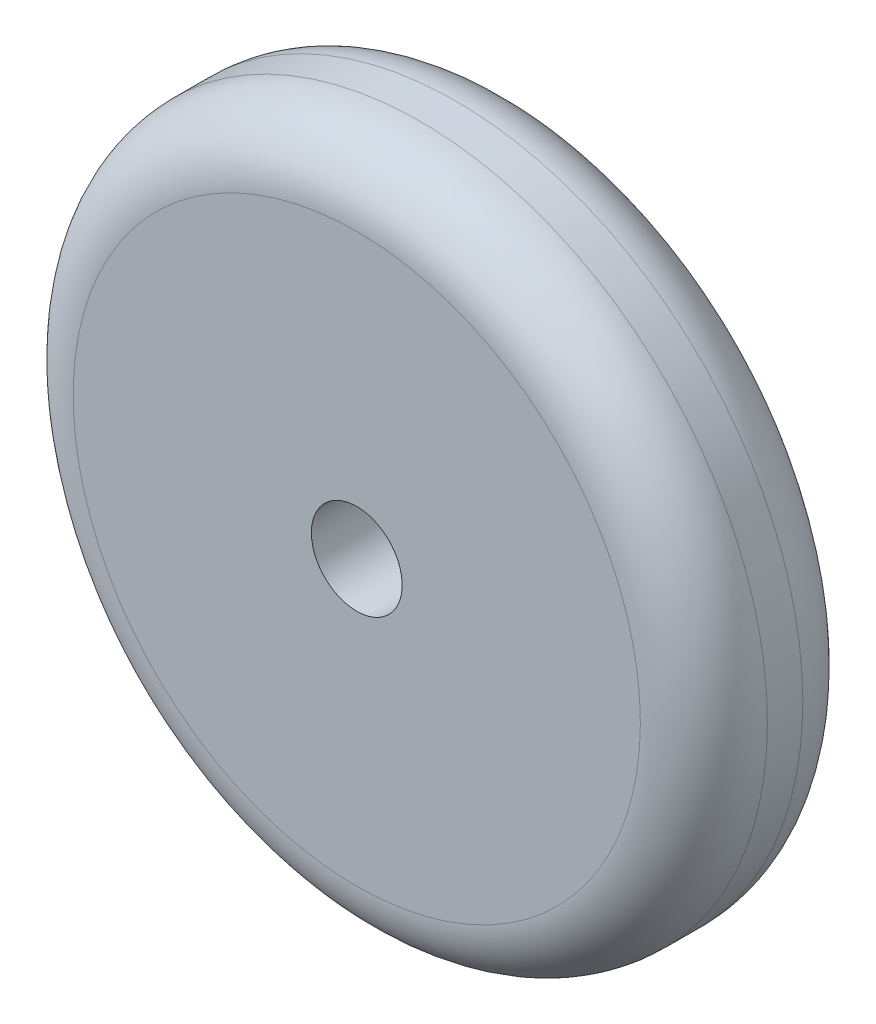
ISO-10303-21;
HEADER;
FILE_DESCRIPTION(('STEP AP214'),'2;1');
FILE_NAME('part.step','',(''),(''),'','','');
FILE_SCHEMA(('AUTOMOTIVE_DESIGN { 1 0 10303 214 1 1 1 1 }'));
ENDSEC;
DATA;
#1=APPLICATION_CONTEXT('core data for automotive mechanical design processes');
#2=APPLICATION_PROTOCOL_DEFINITION('international standard','automotive_design',2000,#1);
#3=PRODUCT_CONTEXT('',#1,'mechanical');
#4=PRODUCT('Part','Part','',(#3));
#5=PRODUCT_RELATED_PRODUCT_CATEGORY('part','',(#4));
#6=PRODUCT_DEFINITION_FORMATION('','',#4);
#7=PRODUCT_DEFINITION_CONTEXT('part definition',#1,'design');
#8=PRODUCT_DEFINITION('design','',#6,#7);
#9=PRODUCT_DEFINITION_SHAPE('','',#8);
#10=(LENGTH_UNIT() NAMED_UNIT(*) SI_UNIT(.MILLI.,.METRE.));
#11=(NAMED_UNIT(*) PLANE_ANGLE_UNIT() SI_UNIT($,.RADIAN.));
#12=(NAMED_UNIT(*) SI_UNIT($,.STERADIAN.) SOLID_ANGLE_UNIT());
#13=UNCERTAINTY_MEASURE_WITH_UNIT(LENGTH_MEASURE(1.E-05),#10,'distance_accuracy_value','');
#14=(GEOMETRIC_REPRESENTATION_CONTEXT(3) GLOBAL_UNCERTAINTY_ASSIGNED_CONTEXT((#13)) GLOBAL_UNIT_ASSIGNED_CONTEXT((#10,
#11,#12)) REPRESENTATION_CONTEXT('',''));
#15=CARTESIAN_POINT('',(0.,0.,0.));
#16=DIRECTION('',(0.,0.,1.));
#17=DIRECTION('',(1.,0.,0.));
#18=AXIS2_PLACEMENT_3D('',#15,#16,#17);
#19=CARTESIAN_POINT('',(97.155,0.,22.733));
#20=DIRECTION('',(0.,0.,1.));
#21=DIRECTION('',(1.,0.,0.));
#22=AXIS2_PLACEMENT_3D('',#19,#20,#21);
#23=PLANE('',#22);
#24=CARTESIAN_POINT('',(0.,0.,22.733));
#25=DIRECTION('',(0.,0.,1.));
#26=DIRECTION('',(1.,0.,0.));
#27=AXIS2_PLACEMENT_3D('',#24,#25,#26);
#28=CIRCLE('',#27,79.375);
#29=CARTESIAN_POINT('',(79.375,0.,22.733));
#30=VERTEX_POINT('',#29);
#31=EDGE_CURVE('E10',#30,#30,#28,.T.);
#32=ORIENTED_EDGE('',*,*,#31,.T.);
#33=EDGE_LOOP('',(#32));
#34=FACE_BOUND('',#33,.T.);
#35=CARTESIAN_POINT('',(0.,0.,22.733));
#36=DIRECTION('',(0.,0.,-1.));
#37=DIRECTION('',(-1.,0.,0.));
#38=AXIS2_PLACEMENT_3D('',#35,#36,#37);
#39=CIRCLE('',#38,12.7);
#40=CARTESIAN_POINT('',(-12.7,0.,22.733));
#41=VERTEX_POINT('',#40);
#42=EDGE_CURVE('E52',#41,#41,#39,.T.);
#43=ORIENTED_EDGE('',*,*,#42,.T.);
#44=EDGE_LOOP('',(#43));
#45=FACE_BOUND('',#44,.T.);
#46=ADVANCED_FACE('F32',(#34,#45),#23,.T.);
#47=CARTESIAN_POINT('',(0.,0.,22.733));
#48=DIRECTION('',(0.,0.,-1.));
#49=DIRECTION('',(-1.,0.,0.));
#50=AXIS2_PLACEMENT_3D('',#47,#48,#49);
#51=CYLINDRICAL_SURFACE('',#50,12.7);
#52=CARTESIAN_POINT('',(0.,0.,-22.733));
#53=DIRECTION('',(0.,0.,-1.));
#54=DIRECTION('',(-1.,0.,0.));
#55=AXIS2_PLACEMENT_3D('',#52,#53,#54);
#56=CIRCLE('',#55,12.7);
#57=CARTESIAN_POINT('',(-12.7,0.,-22.733));
#58=VERTEX_POINT('',#57);
#59=EDGE_CURVE('E55',#58,#58,#56,.T.);
#60=ORIENTED_EDGE('',*,*,#59,.T.);
#61=EDGE_LOOP('',(#60));
#62=FACE_BOUND('',#61,.T.);
#63=ORIENTED_EDGE('',*,*,#42,.F.);
#64=EDGE_LOOP('',(#63));
#65=FACE_BOUND('',#64,.T.);
#66=ADVANCED_FACE('F59',(#62,#65),#51,.F.);
#67=CARTESIAN_POINT('',(12.7,0.,-22.733));
#68=DIRECTION('',(0.,0.,-1.));
#69=DIRECTION('',(-1.,0.,0.));
#70=AXIS2_PLACEMENT_3D('',#67,#68,#69);
#71=PLANE('',#70);
#72=CARTESIAN_POINT('',(0.,0.,-22.733));
#73=DIRECTION('',(0.,0.,-1.));
#74=DIRECTION('',(-1.,0.,0.));
#75=AXIS2_PLACEMENT_3D('',#72,#73,#74);
#76=CIRCLE('',#75,79.375);
#77=CARTESIAN_POINT('',(-79.375,0.,-22.733));
#78=VERTEX_POINT('',#77);
#79=EDGE_CURVE('E47',#78,#78,#76,.T.);
#80=ORIENTED_EDGE('',*,*,#79,.T.);
#81=EDGE_LOOP('',(#80));
#82=FACE_BOUND('',#81,.T.);
#83=ORIENTED_EDGE('',*,*,#59,.F.);
#84=EDGE_LOOP('',(#83));
#85=FACE_BOUND('',#84,.T.);
#86=ADVANCED_FACE('F62',(#82,#85),#71,.T.);
#87=CARTESIAN_POINT('',(0.,0.,22.733));
#88=DIRECTION('',(0.,0.,-1.));
#89=DIRECTION('',(-1.,0.,0.));
#90=AXIS2_PLACEMENT_3D('',#87,#88,#89);
#91=CYLINDRICAL_SURFACE('',#90,97.155);
#92=CARTESIAN_POINT('',(0.,0.,-4.953));
#93=DIRECTION('',(0.,0.,-1.));
#94=DIRECTION('',(-1.,0.,0.));
#95=AXIS2_PLACEMENT_3D('',#92,#93,#94);
#96=CIRCLE('',#95,97.155);
#97=CARTESIAN_POINT('',(-97.155,0.,-4.953));
#98=VERTEX_POINT('',#97);
#99=EDGE_CURVE('E39',#98,#98,#96,.F.);
#100=ORIENTED_EDGE('',*,*,#99,.T.);
#101=EDGE_LOOP('',(#100));
#102=FACE_BOUND('',#101,.T.);
#103=CARTESIAN_POINT('',(0.,0.,4.953));
#104=DIRECTION('',(0.,0.,1.));
#105=DIRECTION('',(1.,0.,0.));
#106=AXIS2_PLACEMENT_3D('',#103,#104,#105);
#107=CIRCLE('',#106,97.155);
#108=CARTESIAN_POINT('',(97.155,0.,4.953));
#109=VERTEX_POINT('',#108);
#110=EDGE_CURVE('E43',#109,#109,#107,.F.);
#111=ORIENTED_EDGE('',*,*,#110,.T.);
#112=EDGE_LOOP('',(#111));
#113=FACE_BOUND('',#112,.T.);
#114=ADVANCED_FACE('F64',(#102,#113),#91,.T.);
#115=CARTESIAN_POINT('',(0.,0.,-4.953));
#116=DIRECTION('',(0.,0.,-1.));
#117=DIRECTION('',(-1.,0.,0.));
#118=AXIS2_PLACEMENT_3D('',#115,#116,#117);
#119=TOROIDAL_SURFACE('',#118,79.375,17.78);
#120=ORIENTED_EDGE('',*,*,#99,.F.);
#121=EDGE_LOOP('',(#120));
#122=FACE_BOUND('',#121,.T.);
#123=ORIENTED_EDGE('',*,*,#79,.F.);
#124=EDGE_LOOP('',(#123));
#125=FACE_BOUND('',#124,.T.);
#126=ADVANCED_FACE('F71',(#122,#125),#119,.T.);
#127=CARTESIAN_POINT('',(0.,0.,4.953));
#128=DIRECTION('',(0.,0.,1.));
#129=DIRECTION('',(1.,0.,0.));
#130=AXIS2_PLACEMENT_3D('',#127,#128,#129);
#131=TOROIDAL_SURFACE('',#130,79.375,17.78);
#132=ORIENTED_EDGE('',*,*,#31,.F.);
#133=EDGE_LOOP('',(#132));
#134=FACE_BOUND('',#133,.T.);
#135=ORIENTED_EDGE('',*,*,#110,.F.);
#136=EDGE_LOOP('',(#135));
#137=FACE_BOUND('',#136,.T.);
#138=ADVANCED_FACE('F34',(#134,#137),#131,.T.);
#139=CLOSED_SHELL('',(#46,#66,#86,#114,#126,#138));
#140=MANIFOLD_SOLID_BREP('B2',#139);
#141=ADVANCED_BREP_SHAPE_REPRESENTATION('',(#18,#140),#14);
#142=SHAPE_DEFINITION_REPRESENTATION(#9,#141);
ENDSEC;
END-ISO-10303-21;
